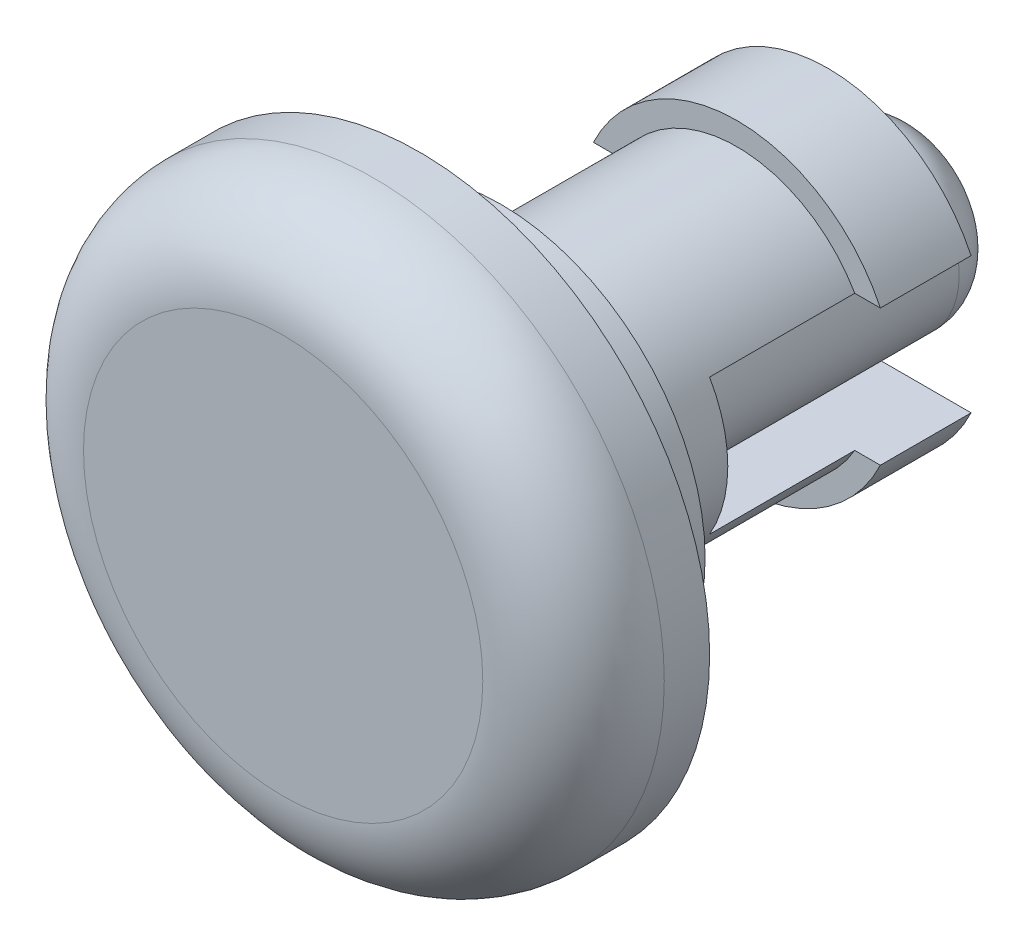
ISO-10303-21;
HEADER;
FILE_DESCRIPTION(('STEP AP214'),'2;1');
FILE_NAME('part.step','',(''),(''),'','','');
FILE_SCHEMA(('AUTOMOTIVE_DESIGN { 1 0 10303 214 1 1 1 1 }'));
ENDSEC;
DATA;
#1=APPLICATION_CONTEXT('core data for automotive mechanical design processes');
#2=APPLICATION_PROTOCOL_DEFINITION('international standard','automotive_design',2000,#1);
#3=PRODUCT_CONTEXT('',#1,'mechanical');
#4=PRODUCT('Part','Part','',(#3));
#5=PRODUCT_RELATED_PRODUCT_CATEGORY('part','',(#4));
#6=PRODUCT_DEFINITION_FORMATION('','',#4);
#7=PRODUCT_DEFINITION_CONTEXT('part definition',#1,'design');
#8=PRODUCT_DEFINITION('design','',#6,#7);
#9=PRODUCT_DEFINITION_SHAPE('','',#8);
#10=(LENGTH_UNIT() NAMED_UNIT(*) SI_UNIT(.MILLI.,.METRE.));
#11=(NAMED_UNIT(*) PLANE_ANGLE_UNIT() SI_UNIT($,.RADIAN.));
#12=(NAMED_UNIT(*) SI_UNIT($,.STERADIAN.) SOLID_ANGLE_UNIT());
#13=UNCERTAINTY_MEASURE_WITH_UNIT(LENGTH_MEASURE(1.E-05),#10,'distance_accuracy_value','');
#14=(GEOMETRIC_REPRESENTATION_CONTEXT(3) GLOBAL_UNCERTAINTY_ASSIGNED_CONTEXT((#13)) GLOBAL_UNIT_ASSIGNED_CONTEXT((#10,
#11,#12)) REPRESENTATION_CONTEXT('',''));
#15=CARTESIAN_POINT('',(0.,0.,0.));
#16=DIRECTION('',(0.,0.,1.));
#17=DIRECTION('',(1.,0.,0.));
#18=AXIS2_PLACEMENT_3D('',#15,#16,#17);
#19=CARTESIAN_POINT('',(0.,0.,-5.5));
#20=DIRECTION('',(0.,0.,1.));
#21=DIRECTION('',(1.,0.,0.));
#22=AXIS2_PLACEMENT_3D('',#19,#20,#21);
#23=PLANE('',#22);
#24=CARTESIAN_POINT('',(0.,0.,-5.5));
#25=DIRECTION('',(0.,0.,1.));
#26=DIRECTION('',(1.,0.,0.));
#27=AXIS2_PLACEMENT_3D('',#24,#25,#26);
#28=CIRCLE('',#27,0.45);
#29=CARTESIAN_POINT('',(0.45,0.,-5.5));
#30=VERTEX_POINT('',#29);
#31=EDGE_CURVE('P0_E11',#30,#30,#28,.F.);
#32=ORIENTED_EDGE('',*,*,#31,.T.);
#33=EDGE_LOOP('',(#32));
#34=FACE_BOUND('',#33,.T.);
#35=ADVANCED_FACE('P0_F17',(#34),#23,.F.);
#36=CARTESIAN_POINT('',(0.,0.,0.));
#37=DIRECTION('',(0.,0.,1.));
#38=DIRECTION('',(1.,0.,0.));
#39=AXIS2_PLACEMENT_3D('',#36,#37,#38);
#40=CYLINDRICAL_SURFACE('',#39,0.95);
#41=CARTESIAN_POINT('',(0.,0.,-5.));
#42=DIRECTION('',(0.,0.,1.));
#43=DIRECTION('',(1.,0.,0.));
#44=AXIS2_PLACEMENT_3D('',#41,#42,#43);
#45=CIRCLE('',#44,0.95);
#46=CARTESIAN_POINT('',(0.95,0.,-5.));
#47=VERTEX_POINT('',#46);
#48=EDGE_CURVE('P0_E24',#47,#47,#45,.T.);
#49=ORIENTED_EDGE('',*,*,#48,.T.);
#50=EDGE_LOOP('',(#49));
#51=FACE_BOUND('',#50,.T.);
#52=CARTESIAN_POINT('',(0.,0.,0.));
#53=DIRECTION('',(0.,0.,1.));
#54=DIRECTION('',(1.,0.,0.));
#55=AXIS2_PLACEMENT_3D('',#52,#53,#54);
#56=CIRCLE('',#55,0.95);
#57=CARTESIAN_POINT('',(0.95,0.,0.));
#58=VERTEX_POINT('',#57);
#59=EDGE_CURVE('P0_E37',#58,#58,#56,.T.);
#60=ORIENTED_EDGE('',*,*,#59,.F.);
#61=EDGE_LOOP('',(#60));
#62=FACE_BOUND('',#61,.T.);
#63=ADVANCED_FACE('P0_F49',(#51,#62),#40,.T.);
#64=CARTESIAN_POINT('',(0.,0.95,0.));
#65=DIRECTION('',(0.,0.,1.));
#66=DIRECTION('',(1.,0.,0.));
#67=AXIS2_PLACEMENT_3D('',#64,#65,#66);
#68=PLANE('',#67);
#69=CARTESIAN_POINT('',(0.,0.,0.));
#70=DIRECTION('',(0.,0.,1.));
#71=DIRECTION('',(1.,0.,0.));
#72=AXIS2_PLACEMENT_3D('',#69,#70,#71);
#73=CIRCLE('',#72,3.2);
#74=CARTESIAN_POINT('',(3.2,0.,0.));
#75=VERTEX_POINT('',#74);
#76=EDGE_CURVE('P0_E40',#75,#75,#73,.T.);
#77=ORIENTED_EDGE('',*,*,#76,.F.);
#78=EDGE_LOOP('',(#77));
#79=FACE_BOUND('',#78,.T.);
#80=ORIENTED_EDGE('',*,*,#59,.T.);
#81=EDGE_LOOP('',(#80));
#82=FACE_BOUND('',#81,.T.);
#83=ADVANCED_FACE('P0_F46',(#79,#82),#68,.F.);
#84=CARTESIAN_POINT('',(0.,0.,0.));
#85=DIRECTION('',(0.,0.,1.));
#86=DIRECTION('',(1.,0.,0.));
#87=AXIS2_PLACEMENT_3D('',#84,#85,#86);
#88=CYLINDRICAL_SURFACE('',#87,3.2);
#89=CARTESIAN_POINT('',(0.,0.,0.5));
#90=DIRECTION('',(0.,0.,-1.));
#91=DIRECTION('',(-1.,0.,0.));
#92=AXIS2_PLACEMENT_3D('',#89,#90,#91);
#93=CIRCLE('',#92,3.2);
#94=CARTESIAN_POINT('',(-3.2,0.,0.5));
#95=VERTEX_POINT('',#94);
#96=EDGE_CURVE('P0_E28',#95,#95,#93,.T.);
#97=ORIENTED_EDGE('',*,*,#96,.T.);
#98=EDGE_LOOP('',(#97));
#99=FACE_BOUND('',#98,.T.);
#100=ORIENTED_EDGE('',*,*,#76,.T.);
#101=EDGE_LOOP('',(#100));
#102=FACE_BOUND('',#101,.T.);
#103=ADVANCED_FACE('P0_F44',(#99,#102),#88,.T.);
#104=CARTESIAN_POINT('',(0.,3.2,1.5));
#105=DIRECTION('',(0.,0.,-1.));
#106=DIRECTION('',(-1.,0.,0.));
#107=AXIS2_PLACEMENT_3D('',#104,#105,#106);
#108=PLANE('',#107);
#109=CARTESIAN_POINT('',(0.,0.,1.5));
#110=DIRECTION('',(0.,0.,-1.));
#111=DIRECTION('',(-1.,0.,0.));
#112=AXIS2_PLACEMENT_3D('',#109,#110,#111);
#113=CIRCLE('',#112,2.2);
#114=CARTESIAN_POINT('',(-2.2,0.,1.5));
#115=VERTEX_POINT('',#114);
#116=EDGE_CURVE('P0_E32',#115,#115,#113,.F.);
#117=ORIENTED_EDGE('',*,*,#116,.T.);
#118=EDGE_LOOP('',(#117));
#119=FACE_BOUND('',#118,.T.);
#120=ADVANCED_FACE('P0_F64',(#119),#108,.F.);
#121=CARTESIAN_POINT('',(0.,0.,0.5));
#122=DIRECTION('',(0.,0.,-1.));
#123=DIRECTION('',(-1.,0.,0.));
#124=AXIS2_PLACEMENT_3D('',#121,#122,#123);
#125=TOROIDAL_SURFACE('',#124,2.2,1.);
#126=ORIENTED_EDGE('',*,*,#96,.F.);
#127=EDGE_LOOP('',(#126));
#128=FACE_BOUND('',#127,.T.);
#129=ORIENTED_EDGE('',*,*,#116,.F.);
#130=EDGE_LOOP('',(#129));
#131=FACE_BOUND('',#130,.T.);
#132=ADVANCED_FACE('P0_F62',(#128,#131),#125,.T.);
#133=CARTESIAN_POINT('',(0.,0.,-5.));
#134=DIRECTION('',(0.,0.,1.));
#135=DIRECTION('',(1.,0.,0.));
#136=AXIS2_PLACEMENT_3D('',#133,#134,#135);
#137=DEGENERATE_TOROIDAL_SURFACE('',#136,0.45,0.5,.T.);
#138=ORIENTED_EDGE('',*,*,#31,.F.);
#139=EDGE_LOOP('',(#138));
#140=FACE_BOUND('',#139,.T.);
#141=ORIENTED_EDGE('',*,*,#48,.F.);
#142=EDGE_LOOP('',(#141));
#143=FACE_BOUND('',#142,.T.);
#144=ADVANCED_FACE('P0_F19',(#140,#143),#137,.T.);
#145=CLOSED_SHELL('',(#35,#63,#83,#103,#120,#132,#144));
#146=MANIFOLD_SOLID_BREP('P0_B1',#145);
#147=CARTESIAN_POINT('',(0.,0.,-10.4497474683058));
#148=DIRECTION('',(0.,0.,1.));
#149=DIRECTION('',(1.,0.,0.));
#150=AXIS2_PLACEMENT_3D('',#147,#148,#149);
#151=CYLINDRICAL_SURFACE('',#150,1.75);
#152=DIRECTION('',(0.,0.,1.));
#153=VECTOR('',#152,1.);
#154=CARTESIAN_POINT('',(-1.58113883008419,0.75,-10.4497474683058));
#155=LINE('',#154,#153);
#156=CARTESIAN_POINT('',(-1.58113883008419,0.75,-4.5));
#157=VERTEX_POINT('',#156);
#158=CARTESIAN_POINT('',(-1.58113883008419,0.75,-3.5));
#159=VERTEX_POINT('',#158);
#160=EDGE_CURVE('P1_E42',#157,#159,#155,.T.);
#161=ORIENTED_EDGE('',*,*,#160,.T.);
#162=CARTESIAN_POINT('',(0.,0.,-3.5));
#163=DIRECTION('',(0.,0.,1.));
#164=DIRECTION('',(1.,0.,0.));
#165=AXIS2_PLACEMENT_3D('',#162,#163,#164);
#166=CIRCLE('',#165,1.75);
#167=CARTESIAN_POINT('',(1.58113883008419,0.75,-3.5));
#168=VERTEX_POINT('',#167);
#169=EDGE_CURVE('P1_E109',#168,#159,#166,.T.);
#170=ORIENTED_EDGE('',*,*,#169,.F.);
#171=DIRECTION('',(0.,0.,1.));
#172=VECTOR('',#171,1.);
#173=CARTESIAN_POINT('',(1.58113883008419,0.75,-10.4497474683058));
#174=LINE('',#173,#172);
#175=CARTESIAN_POINT('',(1.58113883008419,0.75,-4.5));
#176=VERTEX_POINT('',#175);
#177=EDGE_CURVE('P1_E139',#168,#176,#174,.F.);
#178=ORIENTED_EDGE('',*,*,#177,.T.);
#179=CARTESIAN_POINT('',(0.,0.,-4.5));
#180=DIRECTION('',(0.,0.,1.));
#181=DIRECTION('',(1.,0.,0.));
#182=AXIS2_PLACEMENT_3D('',#179,#180,#181);
#183=CIRCLE('',#182,1.75);
#184=EDGE_CURVE('P1_E159',#176,#157,#183,.T.);
#185=ORIENTED_EDGE('',*,*,#184,.T.);
#186=EDGE_LOOP('',(#161,#170,#178,#185));
#187=FACE_BOUND('',#186,.T.);
#188=ADVANCED_FACE('P1_F19',(#187),#151,.T.);
#189=CARTESIAN_POINT('',(0.,0.,-4.5));
#190=DIRECTION('',(0.,0.,1.));
#191=DIRECTION('',(1.,0.,0.));
#192=AXIS2_PLACEMENT_3D('',#189,#190,#191);
#193=PLANE('',#192);
#194=CARTESIAN_POINT('',(-1.58113883008419,-0.75,-4.5));
#195=VERTEX_POINT('',#194);
#196=CARTESIAN_POINT('',(1.58113883008419,-0.75,-4.5));
#197=VERTEX_POINT('',#196);
#198=EDGE_CURVE('P1_E163',#195,#197,#183,.T.);
#199=ORIENTED_EDGE('',*,*,#198,.F.);
#200=DIRECTION('',(1.,0.,0.));
#201=VECTOR('',#200,1.);
#202=CARTESIAN_POINT('',(0.,-0.75,-4.5));
#203=LINE('',#202,#201);
#204=CARTESIAN_POINT('',(-0.583095189484518,-0.75,-4.5));
#205=VERTEX_POINT('',#204);
#206=EDGE_CURVE('P1_E181',#195,#205,#203,.T.);
#207=ORIENTED_EDGE('',*,*,#206,.T.);
#208=CARTESIAN_POINT('',(0.,0.,-4.5));
#209=DIRECTION('',(0.,0.,1.));
#210=DIRECTION('',(1.,0.,0.));
#211=AXIS2_PLACEMENT_3D('',#208,#209,#210);
#212=CIRCLE('',#211,0.95);
#213=CARTESIAN_POINT('',(0.583095189484518,-0.75,-4.5));
#214=VERTEX_POINT('',#213);
#215=EDGE_CURVE('P1_E162',#205,#214,#212,.T.);
#216=ORIENTED_EDGE('',*,*,#215,.T.);
#217=EDGE_CURVE('P1_E179',#214,#197,#203,.T.);
#218=ORIENTED_EDGE('',*,*,#217,.T.);
#219=EDGE_LOOP('',(#199,#207,#216,#218));
#220=FACE_BOUND('',#219,.T.);
#221=ADVANCED_FACE('P1_F190',(#220),#193,.F.);
#222=CARTESIAN_POINT('',(0.,0.,-0.9));
#223=DIRECTION('',(0.,0.,-1.));
#224=DIRECTION('',(-1.,0.,0.));
#225=AXIS2_PLACEMENT_3D('',#222,#223,#224);
#226=PLANE('',#225);
#227=CARTESIAN_POINT('',(0.,0.,-0.9));
#228=DIRECTION('',(0.,0.,-1.));
#229=DIRECTION('',(-1.,0.,0.));
#230=AXIS2_PLACEMENT_3D('',#227,#228,#229);
#231=CIRCLE('',#230,2.25);
#232=CARTESIAN_POINT('',(-2.25,0.,-0.9));
#233=VERTEX_POINT('',#232);
#234=EDGE_CURVE('P1_E171',#233,#233,#231,.T.);
#235=ORIENTED_EDGE('',*,*,#234,.T.);
#236=EDGE_LOOP('',(#235));
#237=FACE_BOUND('',#236,.T.);
#238=CARTESIAN_POINT('',(0.,0.,-0.9));
#239=DIRECTION('',(0.,0.,1.));
#240=DIRECTION('',(1.,0.,0.));
#241=AXIS2_PLACEMENT_3D('',#238,#239,#240);
#242=CIRCLE('',#241,1.5);
#243=CARTESIAN_POINT('',(1.5,0.,-0.9));
#244=VERTEX_POINT('',#243);
#245=EDGE_CURVE('P1_E231',#244,#244,#242,.T.);
#246=ORIENTED_EDGE('',*,*,#245,.T.);
#247=EDGE_LOOP('',(#246));
#248=FACE_BOUND('',#247,.T.);
#249=ADVANCED_FACE('P1_F257',(#237,#248),#226,.T.);
#250=CARTESIAN_POINT('',(0.,0.,0.));
#251=DIRECTION('',(0.,0.,-1.));
#252=DIRECTION('',(-1.,0.,0.));
#253=AXIS2_PLACEMENT_3D('',#250,#251,#252);
#254=PLANE('',#253);
#255=CARTESIAN_POINT('',(0.,0.,0.));
#256=DIRECTION('',(0.,0.,-1.));
#257=DIRECTION('',(-1.,0.,0.));
#258=AXIS2_PLACEMENT_3D('',#255,#256,#257);
#259=CIRCLE('',#258,2.25);
#260=CARTESIAN_POINT('',(-2.25,0.,0.));
#261=VERTEX_POINT('',#260);
#262=EDGE_CURVE('P1_E170',#261,#261,#259,.T.);
#263=ORIENTED_EDGE('',*,*,#262,.F.);
#264=EDGE_LOOP('',(#263));
#265=FACE_BOUND('',#264,.T.);
#266=CARTESIAN_POINT('',(0.,0.,0.));
#267=DIRECTION('',(0.,0.,-1.));
#268=DIRECTION('',(-1.,0.,0.));
#269=AXIS2_PLACEMENT_3D('',#266,#267,#268);
#270=CIRCLE('',#269,0.95);
#271=CARTESIAN_POINT('',(-0.95,0.,0.));
#272=VERTEX_POINT('',#271);
#273=EDGE_CURVE('P1_E167',#272,#272,#270,.T.);
#274=ORIENTED_EDGE('',*,*,#273,.T.);
#275=EDGE_LOOP('',(#274));
#276=FACE_BOUND('',#275,.T.);
#277=ADVANCED_FACE('P1_F271',(#265,#276),#254,.F.);
#278=CARTESIAN_POINT('',(0.,0.,-0.9));
#279=DIRECTION('',(0.,0.,1.));
#280=DIRECTION('',(1.,0.,0.));
#281=AXIS2_PLACEMENT_3D('',#278,#279,#280);
#282=CYLINDRICAL_SURFACE('',#281,2.25);
#283=ORIENTED_EDGE('',*,*,#234,.F.);
#284=EDGE_LOOP('',(#283));
#285=FACE_BOUND('',#284,.T.);
#286=ORIENTED_EDGE('',*,*,#262,.T.);
#287=EDGE_LOOP('',(#286));
#288=FACE_BOUND('',#287,.T.);
#289=ADVANCED_FACE('P1_F21',(#285,#288),#282,.T.);
#290=CARTESIAN_POINT('',(0.,0.,-0.9));
#291=DIRECTION('',(0.,0.,1.));
#292=DIRECTION('',(1.,0.,0.));
#293=AXIS2_PLACEMENT_3D('',#290,#291,#292);
#294=CYLINDRICAL_SURFACE('',#293,0.95);
#295=DIRECTION('',(0.,0.,1.));
#296=VECTOR('',#295,1.);
#297=CARTESIAN_POINT('',(0.583095189484518,-0.75,-0.9));
#298=LINE('',#297,#296);
#299=CARTESIAN_POINT('',(0.583095189484518,-0.75,-1.9));
#300=VERTEX_POINT('',#299);
#301=EDGE_CURVE('P1_E153',#214,#300,#298,.T.);
#302=ORIENTED_EDGE('',*,*,#301,.F.);
#303=ORIENTED_EDGE('',*,*,#215,.F.);
#304=DIRECTION('',(0.,0.,1.));
#305=VECTOR('',#304,1.);
#306=CARTESIAN_POINT('',(-0.583095189484518,-0.75,-0.9));
#307=LINE('',#306,#305);
#308=CARTESIAN_POINT('',(-0.583095189484518,-0.75,-1.9));
#309=VERTEX_POINT('',#308);
#310=EDGE_CURVE('P1_E151',#309,#205,#307,.F.);
#311=ORIENTED_EDGE('',*,*,#310,.F.);
#312=CARTESIAN_POINT('',(0.,0.,-1.9));
#313=DIRECTION('',(0.,0.,-1.));
#314=DIRECTION('',(-1.,0.,0.));
#315=AXIS2_PLACEMENT_3D('',#312,#313,#314);
#316=CIRCLE('',#315,0.95);
#317=CARTESIAN_POINT('',(-0.583095189484518,0.75,-1.9));
#318=VERTEX_POINT('',#317);
#319=EDGE_CURVE('P1_E155',#309,#318,#316,.T.);
#320=ORIENTED_EDGE('',*,*,#319,.T.);
#321=DIRECTION('',(0.,0.,1.));
#322=VECTOR('',#321,1.);
#323=CARTESIAN_POINT('',(-0.583095189484518,0.75,-0.9));
#324=LINE('',#323,#322);
#325=CARTESIAN_POINT('',(-0.583095189484518,0.75,-4.5));
#326=VERTEX_POINT('',#325);
#327=EDGE_CURVE('P1_E144',#326,#318,#324,.T.);
#328=ORIENTED_EDGE('',*,*,#327,.F.);
#329=CARTESIAN_POINT('',(0.583095189484518,0.75,-4.5));
#330=VERTEX_POINT('',#329);
#331=EDGE_CURVE('P1_E164',#330,#326,#212,.T.);
#332=ORIENTED_EDGE('',*,*,#331,.F.);
#333=DIRECTION('',(0.,0.,1.));
#334=VECTOR('',#333,1.);
#335=CARTESIAN_POINT('',(0.583095189484518,0.75,-0.9));
#336=LINE('',#335,#334);
#337=CARTESIAN_POINT('',(0.583095189484518,0.75,-1.9));
#338=VERTEX_POINT('',#337);
#339=EDGE_CURVE('P1_E142',#338,#330,#336,.F.);
#340=ORIENTED_EDGE('',*,*,#339,.F.);
#341=EDGE_CURVE('P1_E158',#338,#300,#316,.T.);
#342=ORIENTED_EDGE('',*,*,#341,.T.);
#343=EDGE_LOOP('',(#302,#303,#311,#320,#328,#332,#340,#342));
#344=FACE_BOUND('',#343,.T.);
#345=ORIENTED_EDGE('',*,*,#273,.F.);
#346=EDGE_LOOP('',(#345));
#347=FACE_BOUND('',#346,.T.);
#348=ADVANCED_FACE('P1_F197',(#344,#347),#294,.F.);
#349=DIRECTION('',(0.,0.,1.));
#350=VECTOR('',#349,1.);
#351=CARTESIAN_POINT('',(1.58113883008419,-0.75,-10.4497474683058));
#352=LINE('',#351,#350);
#353=CARTESIAN_POINT('',(1.58113883008419,-0.75,-3.5));
#354=VERTEX_POINT('',#353);
#355=EDGE_CURVE('P1_E148',#197,#354,#352,.T.);
#356=ORIENTED_EDGE('',*,*,#355,.T.);
#357=CARTESIAN_POINT('',(-1.58113883008419,-0.75,-3.5));
#358=VERTEX_POINT('',#357);
#359=EDGE_CURVE('P1_E119',#358,#354,#166,.T.);
#360=ORIENTED_EDGE('',*,*,#359,.F.);
#361=DIRECTION('',(0.,0.,1.));
#362=VECTOR('',#361,1.);
#363=CARTESIAN_POINT('',(-1.58113883008419,-0.75,-10.4497474683058));
#364=LINE('',#363,#362);
#365=EDGE_CURVE('P1_E146',#358,#195,#364,.F.);
#366=ORIENTED_EDGE('',*,*,#365,.T.);
#367=ORIENTED_EDGE('',*,*,#198,.T.);
#368=EDGE_LOOP('',(#356,#360,#366,#367));
#369=FACE_BOUND('',#368,.T.);
#370=ADVANCED_FACE('P1_F241',(#369),#151,.T.);
#371=ORIENTED_EDGE('',*,*,#184,.F.);
#372=DIRECTION('',(-1.,0.,0.));
#373=VECTOR('',#372,1.);
#374=CARTESIAN_POINT('',(0.,0.75,-4.5));
#375=LINE('',#374,#373);
#376=EDGE_CURVE('P1_E178',#176,#330,#375,.T.);
#377=ORIENTED_EDGE('',*,*,#376,.T.);
#378=ORIENTED_EDGE('',*,*,#331,.T.);
#379=EDGE_CURVE('P1_E174',#326,#157,#375,.T.);
#380=ORIENTED_EDGE('',*,*,#379,.T.);
#381=EDGE_LOOP('',(#371,#377,#378,#380));
#382=FACE_BOUND('',#381,.T.);
#383=ADVANCED_FACE('P1_F227',(#382),#193,.F.);
#384=CARTESIAN_POINT('',(3.11086804606046,0.75,5.5));
#385=DIRECTION('',(0.,1.,0.));
#386=DIRECTION('',(0.,0.,1.));
#387=AXIS2_PLACEMENT_3D('',#384,#385,#386);
#388=PLANE('',#387);
#389=DIRECTION('',(-1.,0.,0.));
#390=VECTOR('',#389,1.);
#391=CARTESIAN_POINT('',(3.11086804606046,0.75,-1.9));
#392=LINE('',#391,#390);
#393=CARTESIAN_POINT('',(-1.29903810567666,0.75,-1.9));
#394=VERTEX_POINT('',#393);
#395=EDGE_CURVE('P1_E125',#318,#394,#392,.T.);
#396=ORIENTED_EDGE('',*,*,#395,.T.);
#397=DIRECTION('',(0.,0.,1.));
#398=VECTOR('',#397,1.);
#399=CARTESIAN_POINT('',(-1.29903810567666,0.75,0.));
#400=LINE('',#399,#398);
#401=CARTESIAN_POINT('',(-1.29903810567666,0.75,-3.5));
#402=VERTEX_POINT('',#401);
#403=EDGE_CURVE('P1_E116',#394,#402,#400,.F.);
#404=ORIENTED_EDGE('',*,*,#403,.T.);
#405=DIRECTION('',(-1.,0.,0.));
#406=VECTOR('',#405,1.);
#407=CARTESIAN_POINT('',(3.11086804606046,0.75,-3.5));
#408=LINE('',#407,#406);
#409=EDGE_CURVE('P1_E106',#402,#159,#408,.T.);
#410=ORIENTED_EDGE('',*,*,#409,.T.);
#411=ORIENTED_EDGE('',*,*,#160,.F.);
#412=ORIENTED_EDGE('',*,*,#379,.F.);
#413=ORIENTED_EDGE('',*,*,#327,.T.);
#414=EDGE_LOOP('',(#396,#404,#410,#411,#412,#413));
#415=FACE_BOUND('',#414,.T.);
#416=ADVANCED_FACE('P1_F123',(#415),#388,.F.);
#417=CARTESIAN_POINT('',(3.11086804606046,-0.75,5.5));
#418=DIRECTION('',(0.,-1.,0.));
#419=DIRECTION('',(0.,0.,-1.));
#420=AXIS2_PLACEMENT_3D('',#417,#418,#419);
#421=PLANE('',#420);
#422=DIRECTION('',(1.,0.,0.));
#423=VECTOR('',#422,1.);
#424=CARTESIAN_POINT('',(3.11086804606046,-0.75,-3.5));
#425=LINE('',#424,#423);
#426=CARTESIAN_POINT('',(-1.29903810567666,-0.75,-3.5));
#427=VERTEX_POINT('',#426);
#428=EDGE_CURVE('P1_E112',#358,#427,#425,.T.);
#429=ORIENTED_EDGE('',*,*,#428,.T.);
#430=DIRECTION('',(0.,0.,1.));
#431=VECTOR('',#430,1.);
#432=CARTESIAN_POINT('',(-1.29903810567666,-0.75,0.));
#433=LINE('',#432,#431);
#434=CARTESIAN_POINT('',(-1.29903810567666,-0.75,-1.9));
#435=VERTEX_POINT('',#434);
#436=EDGE_CURVE('P1_E127',#427,#435,#433,.T.);
#437=ORIENTED_EDGE('',*,*,#436,.T.);
#438=DIRECTION('',(1.,0.,0.));
#439=VECTOR('',#438,1.);
#440=CARTESIAN_POINT('',(3.11086804606046,-0.75,-1.9));
#441=LINE('',#440,#439);
#442=EDGE_CURVE('P1_E130',#435,#309,#441,.T.);
#443=ORIENTED_EDGE('',*,*,#442,.T.);
#444=ORIENTED_EDGE('',*,*,#310,.T.);
#445=ORIENTED_EDGE('',*,*,#206,.F.);
#446=ORIENTED_EDGE('',*,*,#365,.F.);
#447=EDGE_LOOP('',(#429,#437,#443,#444,#445,#446));
#448=FACE_BOUND('',#447,.T.);
#449=ADVANCED_FACE('P1_F219',(#448),#421,.F.);
#450=CARTESIAN_POINT('',(0.,0.,-1.9));
#451=DIRECTION('',(0.,0.,-1.));
#452=DIRECTION('',(-1.,0.,0.));
#453=AXIS2_PLACEMENT_3D('',#450,#451,#452);
#454=PLANE('',#453);
#455=CARTESIAN_POINT('',(0.,0.,-1.9));
#456=DIRECTION('',(0.,0.,-1.));
#457=DIRECTION('',(-1.,0.,0.));
#458=AXIS2_PLACEMENT_3D('',#455,#456,#457);
#459=CIRCLE('',#458,1.5);
#460=EDGE_CURVE('P1_E133',#394,#435,#459,.F.);
#461=ORIENTED_EDGE('',*,*,#460,.F.);
#462=ORIENTED_EDGE('',*,*,#395,.F.);
#463=ORIENTED_EDGE('',*,*,#319,.F.);
#464=ORIENTED_EDGE('',*,*,#442,.F.);
#465=EDGE_LOOP('',(#461,#462,#463,#464));
#466=FACE_BOUND('',#465,.T.);
#467=ADVANCED_FACE('P1_F221',(#466),#454,.T.);
#468=CARTESIAN_POINT('',(0.,0.,-1.9));
#469=DIRECTION('',(0.,0.,-1.));
#470=DIRECTION('',(-1.,0.,0.));
#471=AXIS2_PLACEMENT_3D('',#468,#469,#470);
#472=CIRCLE('',#471,1.5);
#473=CARTESIAN_POINT('',(1.29903810567666,-0.75,-1.9));
#474=VERTEX_POINT('',#473);
#475=CARTESIAN_POINT('',(1.29903810567666,0.75,-1.9));
#476=VERTEX_POINT('',#475);
#477=EDGE_CURVE('P1_E111',#474,#476,#472,.F.);
#478=ORIENTED_EDGE('',*,*,#477,.F.);
#479=EDGE_CURVE('P1_E126',#300,#474,#441,.T.);
#480=ORIENTED_EDGE('',*,*,#479,.F.);
#481=ORIENTED_EDGE('',*,*,#341,.F.);
#482=EDGE_CURVE('P1_E138',#476,#338,#392,.T.);
#483=ORIENTED_EDGE('',*,*,#482,.F.);
#484=EDGE_LOOP('',(#478,#480,#481,#483));
#485=FACE_BOUND('',#484,.T.);
#486=ADVANCED_FACE('P1_F208',(#485),#454,.T.);
#487=ORIENTED_EDGE('',*,*,#479,.T.);
#488=DIRECTION('',(0.,0.,1.));
#489=VECTOR('',#488,1.);
#490=CARTESIAN_POINT('',(1.29903810567666,-0.75,0.));
#491=LINE('',#490,#489);
#492=CARTESIAN_POINT('',(1.29903810567666,-0.75,-3.5));
#493=VERTEX_POINT('',#492);
#494=EDGE_CURVE('P1_E210',#474,#493,#491,.F.);
#495=ORIENTED_EDGE('',*,*,#494,.T.);
#496=DIRECTION('',(1.,0.,0.));
#497=VECTOR('',#496,1.);
#498=CARTESIAN_POINT('',(3.11086804606046,-0.75,-3.5));
#499=LINE('',#498,#497);
#500=EDGE_CURVE('P1_E234',#493,#354,#499,.T.);
#501=ORIENTED_EDGE('',*,*,#500,.T.);
#502=ORIENTED_EDGE('',*,*,#355,.F.);
#503=ORIENTED_EDGE('',*,*,#217,.F.);
#504=ORIENTED_EDGE('',*,*,#301,.T.);
#505=EDGE_LOOP('',(#487,#495,#501,#502,#503,#504));
#506=FACE_BOUND('',#505,.T.);
#507=ADVANCED_FACE('P1_F204',(#506),#421,.F.);
#508=DIRECTION('',(-1.,0.,0.));
#509=VECTOR('',#508,1.);
#510=CARTESIAN_POINT('',(3.11086804606046,0.75,-3.5));
#511=LINE('',#510,#509);
#512=CARTESIAN_POINT('',(1.29903810567666,0.75,-3.5));
#513=VERTEX_POINT('',#512);
#514=EDGE_CURVE('P1_E27',#168,#513,#511,.T.);
#515=ORIENTED_EDGE('',*,*,#514,.T.);
#516=DIRECTION('',(0.,0.,1.));
#517=VECTOR('',#516,1.);
#518=CARTESIAN_POINT('',(1.29903810567666,0.75,0.));
#519=LINE('',#518,#517);
#520=EDGE_CURVE('P1_E12',#513,#476,#519,.T.);
#521=ORIENTED_EDGE('',*,*,#520,.T.);
#522=ORIENTED_EDGE('',*,*,#482,.T.);
#523=ORIENTED_EDGE('',*,*,#339,.T.);
#524=ORIENTED_EDGE('',*,*,#376,.F.);
#525=ORIENTED_EDGE('',*,*,#177,.F.);
#526=EDGE_LOOP('',(#515,#521,#522,#523,#524,#525));
#527=FACE_BOUND('',#526,.T.);
#528=ADVANCED_FACE('P1_F229',(#527),#388,.F.);
#529=CARTESIAN_POINT('',(0.,0.,0.));
#530=DIRECTION('',(0.,0.,1.));
#531=DIRECTION('',(1.,0.,0.));
#532=AXIS2_PLACEMENT_3D('',#529,#530,#531);
#533=CYLINDRICAL_SURFACE('',#532,1.5);
#534=ORIENTED_EDGE('',*,*,#245,.F.);
#535=EDGE_LOOP('',(#534));
#536=FACE_BOUND('',#535,.T.);
#537=ORIENTED_EDGE('',*,*,#460,.T.);
#538=ORIENTED_EDGE('',*,*,#436,.F.);
#539=CARTESIAN_POINT('',(0.,0.,-3.5));
#540=DIRECTION('',(0.,0.,1.));
#541=DIRECTION('',(1.,0.,0.));
#542=AXIS2_PLACEMENT_3D('',#539,#540,#541);
#543=CIRCLE('',#542,1.5);
#544=EDGE_CURVE('P1_E120',#427,#493,#543,.T.);
#545=ORIENTED_EDGE('',*,*,#544,.T.);
#546=ORIENTED_EDGE('',*,*,#494,.F.);
#547=ORIENTED_EDGE('',*,*,#477,.T.);
#548=ORIENTED_EDGE('',*,*,#520,.F.);
#549=EDGE_CURVE('P1_E34',#513,#402,#543,.T.);
#550=ORIENTED_EDGE('',*,*,#549,.T.);
#551=ORIENTED_EDGE('',*,*,#403,.F.);
#552=EDGE_LOOP('',(#537,#538,#545,#546,#547,#548,#550,#551));
#553=FACE_BOUND('',#552,.T.);
#554=ADVANCED_FACE('P1_F115',(#536,#553),#533,.T.);
#555=CARTESIAN_POINT('',(1.5,0.,-3.5));
#556=DIRECTION('',(0.,0.,-1.));
#557=DIRECTION('',(-1.,0.,0.));
#558=AXIS2_PLACEMENT_3D('',#555,#556,#557);
#559=PLANE('',#558);
#560=ORIENTED_EDGE('',*,*,#549,.F.);
#561=ORIENTED_EDGE('',*,*,#514,.F.);
#562=ORIENTED_EDGE('',*,*,#169,.T.);
#563=ORIENTED_EDGE('',*,*,#409,.F.);
#564=EDGE_LOOP('',(#560,#561,#562,#563));
#565=FACE_BOUND('',#564,.T.);
#566=ADVANCED_FACE('P1_F107',(#565),#559,.F.);
#567=ORIENTED_EDGE('',*,*,#359,.T.);
#568=ORIENTED_EDGE('',*,*,#500,.F.);
#569=ORIENTED_EDGE('',*,*,#544,.F.);
#570=ORIENTED_EDGE('',*,*,#428,.F.);
#571=EDGE_LOOP('',(#567,#568,#569,#570));
#572=FACE_BOUND('',#571,.T.);
#573=ADVANCED_FACE('P1_F242',(#572),#559,.F.);
#574=CLOSED_SHELL('',(#188,#221,#249,#277,#289,#348,#370,#383,#416,#449,#467,#486,#507,#528,
#554,#566,#573));
#575=MANIFOLD_SOLID_BREP('P1_B1',#574);
#576=ADVANCED_BREP_SHAPE_REPRESENTATION('',(#18,#146,#575),#14);
#577=SHAPE_DEFINITION_REPRESENTATION(#9,#576);
ENDSEC;
END-ISO-10303-21;
